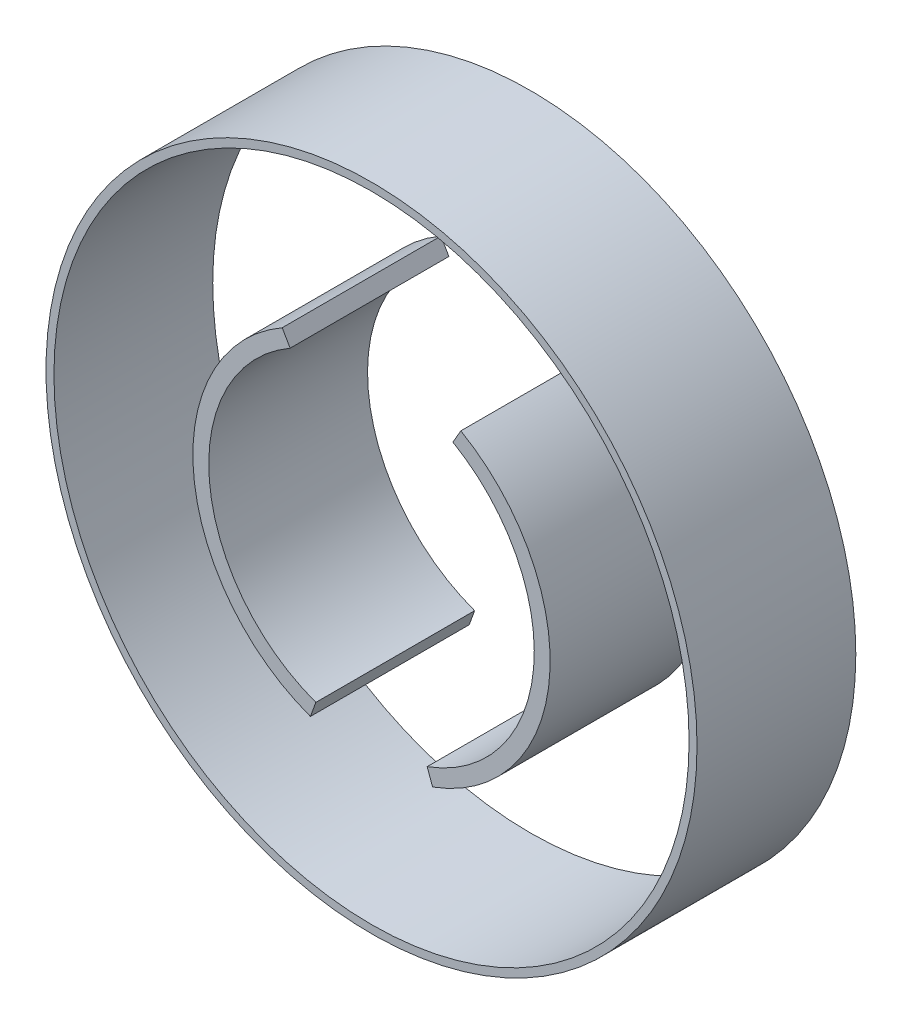
ISO-10303-21;
HEADER;
FILE_DESCRIPTION(('STEP AP214'),'2;1');
FILE_NAME('part.step','',(''),(''),'','','');
FILE_SCHEMA(('AUTOMOTIVE_DESIGN { 1 0 10303 214 1 1 1 1 }'));
ENDSEC;
DATA;
#1=APPLICATION_CONTEXT('core data for automotive mechanical design processes');
#2=APPLICATION_PROTOCOL_DEFINITION('international standard','automotive_design',2000,#1);
#3=PRODUCT_CONTEXT('',#1,'mechanical');
#4=PRODUCT('Part','Part','',(#3));
#5=PRODUCT_RELATED_PRODUCT_CATEGORY('part','',(#4));
#6=PRODUCT_DEFINITION_FORMATION('','',#4);
#7=PRODUCT_DEFINITION_CONTEXT('part definition',#1,'design');
#8=PRODUCT_DEFINITION('design','',#6,#7);
#9=PRODUCT_DEFINITION_SHAPE('','',#8);
#10=(LENGTH_UNIT() NAMED_UNIT(*) SI_UNIT(.MILLI.,.METRE.));
#11=(NAMED_UNIT(*) PLANE_ANGLE_UNIT() SI_UNIT($,.RADIAN.));
#12=(NAMED_UNIT(*) SI_UNIT($,.STERADIAN.) SOLID_ANGLE_UNIT());
#13=UNCERTAINTY_MEASURE_WITH_UNIT(LENGTH_MEASURE(1.E-05),#10,'distance_accuracy_value','');
#14=(GEOMETRIC_REPRESENTATION_CONTEXT(3) GLOBAL_UNCERTAINTY_ASSIGNED_CONTEXT((#13)) GLOBAL_UNIT_ASSIGNED_CONTEXT((#10,
#11,#12)) REPRESENTATION_CONTEXT('',''));
#15=CARTESIAN_POINT('',(0.,0.,0.));
#16=DIRECTION('',(0.,0.,1.));
#17=DIRECTION('',(1.,0.,0.));
#18=AXIS2_PLACEMENT_3D('',#15,#16,#17);
#19=CARTESIAN_POINT('',(0.,0.,2000.));
#20=DIRECTION('',(0.,0.,-1.));
#21=DIRECTION('',(-1.,0.,0.));
#22=AXIS2_PLACEMENT_3D('',#19,#20,#21);
#23=CYLINDRICAL_SURFACE('',#22,2250.);
#24=CARTESIAN_POINT('',(0.,0.,0.));
#25=DIRECTION('',(0.,0.,1.));
#26=DIRECTION('',(1.,0.,0.));
#27=AXIS2_PLACEMENT_3D('',#24,#25,#26);
#28=CIRCLE('',#27,2250.);
#29=CARTESIAN_POINT('',(769.545322482756,-2114.30839676829,0.));
#30=VERTEX_POINT('',#29);
#31=CARTESIAN_POINT('',(1125.,1948.55715851499,0.));
#32=VERTEX_POINT('',#31);
#33=EDGE_CURVE('E120',#30,#32,#28,.T.);
#34=ORIENTED_EDGE('',*,*,#33,.T.);
#35=DIRECTION('',(0.,0.,-1.));
#36=VECTOR('',#35,1.);
#37=CARTESIAN_POINT('',(1125.,1948.55715851499,2000.));
#38=LINE('',#37,#36);
#39=CARTESIAN_POINT('',(1125.,1948.55715851499,2000.));
#40=VERTEX_POINT('',#39);
#41=EDGE_CURVE('E12',#40,#32,#38,.T.);
#42=ORIENTED_EDGE('',*,*,#41,.F.);
#43=CARTESIAN_POINT('',(0.,0.,2000.));
#44=DIRECTION('',(0.,0.,1.));
#45=DIRECTION('',(1.,0.,0.));
#46=AXIS2_PLACEMENT_3D('',#43,#44,#45);
#47=CIRCLE('',#46,2250.);
#48=CARTESIAN_POINT('',(769.545322482756,-2114.30839676829,2000.));
#49=VERTEX_POINT('',#48);
#50=EDGE_CURVE('E104',#49,#40,#47,.T.);
#51=ORIENTED_EDGE('',*,*,#50,.F.);
#52=DIRECTION('',(0.,0.,-1.));
#53=VECTOR('',#52,1.);
#54=CARTESIAN_POINT('',(769.545322482756,-2114.30839676829,2000.));
#55=LINE('',#54,#53);
#56=EDGE_CURVE('E116',#49,#30,#55,.T.);
#57=ORIENTED_EDGE('',*,*,#56,.T.);
#58=EDGE_LOOP('',(#34,#42,#51,#57));
#59=FACE_BOUND('',#58,.T.);
#60=ADVANCED_FACE('F52',(#59),#23,.T.);
#61=CARTESIAN_POINT('',(1125.,1948.55715851499,2000.));
#62=DIRECTION('',(0.866025403784438,-0.500000000000002,0.));
#63=DIRECTION('',(0.500000000000002,0.866025403784438,0.));
#64=AXIS2_PLACEMENT_3D('',#61,#62,#63);
#65=PLANE('',#64);
#66=DIRECTION('',(-0.500000000000002,-0.866025403784438,0.));
#67=VECTOR('',#66,1.);
#68=CARTESIAN_POINT('',(1125.,1948.55715851499,0.));
#69=LINE('',#68,#67);
#70=CARTESIAN_POINT('',(1025.,1775.3520777581,0.));
#71=VERTEX_POINT('',#70);
#72=EDGE_CURVE('E109',#32,#71,#69,.T.);
#73=ORIENTED_EDGE('',*,*,#72,.T.);
#74=DIRECTION('',(0.,0.,-1.));
#75=VECTOR('',#74,1.);
#76=CARTESIAN_POINT('',(1025.,1775.3520777581,2000.));
#77=LINE('',#76,#75);
#78=CARTESIAN_POINT('',(1025.,1775.3520777581,2000.));
#79=VERTEX_POINT('',#78);
#80=EDGE_CURVE('E61',#79,#71,#77,.T.);
#81=ORIENTED_EDGE('',*,*,#80,.F.);
#82=DIRECTION('',(-0.500000000000002,-0.866025403784438,0.));
#83=VECTOR('',#82,1.);
#84=CARTESIAN_POINT('',(1125.,1948.55715851499,2000.));
#85=LINE('',#84,#83);
#86=EDGE_CURVE('E99',#40,#79,#85,.T.);
#87=ORIENTED_EDGE('',*,*,#86,.F.);
#88=ORIENTED_EDGE('',*,*,#41,.T.);
#89=EDGE_LOOP('',(#73,#81,#87,#88));
#90=FACE_BOUND('',#89,.T.);
#91=ADVANCED_FACE('F108',(#90),#65,.F.);
#92=CARTESIAN_POINT('',(0.,0.,2000.));
#93=DIRECTION('',(0.,0.,-1.));
#94=DIRECTION('',(-1.,0.,0.));
#95=AXIS2_PLACEMENT_3D('',#92,#93,#94);
#96=CYLINDRICAL_SURFACE('',#95,2050.);
#97=CARTESIAN_POINT('',(0.,0.,0.));
#98=DIRECTION('',(0.,0.,-1.));
#99=DIRECTION('',(1.,0.,0.));
#100=AXIS2_PLACEMENT_3D('',#97,#98,#99);
#101=CIRCLE('',#100,2050.);
#102=CARTESIAN_POINT('',(701.141293817622,-1926.36987261111,0.));
#103=VERTEX_POINT('',#102);
#104=EDGE_CURVE('E86',#71,#103,#101,.T.);
#105=ORIENTED_EDGE('',*,*,#104,.T.);
#106=DIRECTION('',(0.,0.,-1.));
#107=VECTOR('',#106,1.);
#108=CARTESIAN_POINT('',(701.141293817622,-1926.36987261111,2000.));
#109=LINE('',#108,#107);
#110=CARTESIAN_POINT('',(701.141293817622,-1926.36987261111,2000.));
#111=VERTEX_POINT('',#110);
#112=EDGE_CURVE('E111',#111,#103,#109,.T.);
#113=ORIENTED_EDGE('',*,*,#112,.F.);
#114=CARTESIAN_POINT('',(0.,0.,2000.));
#115=DIRECTION('',(0.,0.,-1.));
#116=DIRECTION('',(1.,0.,0.));
#117=AXIS2_PLACEMENT_3D('',#114,#115,#116);
#118=CIRCLE('',#117,2050.);
#119=EDGE_CURVE('E102',#79,#111,#118,.T.);
#120=ORIENTED_EDGE('',*,*,#119,.F.);
#121=ORIENTED_EDGE('',*,*,#80,.T.);
#122=EDGE_LOOP('',(#105,#113,#120,#121));
#123=FACE_BOUND('',#122,.T.);
#124=ADVANCED_FACE('F112',(#123),#96,.F.);
#125=CARTESIAN_POINT('',(769.545322482756,-2114.30839676829,2000.));
#126=DIRECTION('',(0.939692620785908,0.34202014332567,0.));
#127=DIRECTION('',(-0.34202014332567,0.939692620785908,0.));
#128=AXIS2_PLACEMENT_3D('',#125,#126,#127);
#129=PLANE('',#128);
#130=DIRECTION('',(0.34202014332567,-0.939692620785908,0.));
#131=VECTOR('',#130,1.);
#132=CARTESIAN_POINT('',(769.545322482756,-2114.30839676829,0.));
#133=LINE('',#132,#131);
#134=EDGE_CURVE('E92',#103,#30,#133,.T.);
#135=ORIENTED_EDGE('',*,*,#134,.T.);
#136=ORIENTED_EDGE('',*,*,#56,.F.);
#137=DIRECTION('',(0.34202014332567,-0.939692620785908,0.));
#138=VECTOR('',#137,1.);
#139=CARTESIAN_POINT('',(769.545322482756,-2114.30839676829,2000.));
#140=LINE('',#139,#138);
#141=EDGE_CURVE('E69',#111,#49,#140,.T.);
#142=ORIENTED_EDGE('',*,*,#141,.F.);
#143=ORIENTED_EDGE('',*,*,#112,.T.);
#144=EDGE_LOOP('',(#135,#136,#142,#143));
#145=FACE_BOUND('',#144,.T.);
#146=ADVANCED_FACE('F133',(#145),#129,.F.);
#147=CARTESIAN_POINT('',(0.,0.,2000.));
#148=DIRECTION('',(0.,0.,1.));
#149=DIRECTION('',(1.,0.,0.));
#150=AXIS2_PLACEMENT_3D('',#147,#148,#149);
#151=PLANE('',#150);
#152=ORIENTED_EDGE('',*,*,#50,.T.);
#153=ORIENTED_EDGE('',*,*,#86,.T.);
#154=ORIENTED_EDGE('',*,*,#119,.T.);
#155=ORIENTED_EDGE('',*,*,#141,.T.);
#156=EDGE_LOOP('',(#152,#153,#154,#155));
#157=FACE_BOUND('',#156,.T.);
#158=ADVANCED_FACE('F100',(#157),#151,.T.);
#159=CARTESIAN_POINT('',(0.,0.,0.));
#160=DIRECTION('',(0.,0.,1.));
#161=DIRECTION('',(1.,0.,0.));
#162=AXIS2_PLACEMENT_3D('',#159,#160,#161);
#163=PLANE('',#162);
#164=ORIENTED_EDGE('',*,*,#33,.F.);
#165=ORIENTED_EDGE('',*,*,#134,.F.);
#166=ORIENTED_EDGE('',*,*,#104,.F.);
#167=ORIENTED_EDGE('',*,*,#72,.F.);
#168=EDGE_LOOP('',(#164,#165,#166,#167));
#169=FACE_BOUND('',#168,.T.);
#170=ADVANCED_FACE('F136',(#169),#163,.F.);
#171=CLOSED_SHELL('',(#60,#91,#124,#146,#158,#170));
#172=MANIFOLD_SOLID_BREP('B2',#171);
#173=CARTESIAN_POINT('',(0.,0.,2000.));
#174=DIRECTION('',(0.,0.,-1.));
#175=DIRECTION('',(-1.,0.,0.));
#176=AXIS2_PLACEMENT_3D('',#173,#174,#175);
#177=CYLINDRICAL_SURFACE('',#176,2250.);
#178=CARTESIAN_POINT('',(0.,0.,0.));
#179=DIRECTION('',(0.,0.,1.));
#180=DIRECTION('',(1.,0.,0.));
#181=AXIS2_PLACEMENT_3D('',#178,#179,#180);
#182=CIRCLE('',#181,2250.);
#183=CARTESIAN_POINT('',(-1125.,1948.55715851499,0.));
#184=VERTEX_POINT('',#183);
#185=CARTESIAN_POINT('',(-769.545322482756,-2114.30839676829,0.));
#186=VERTEX_POINT('',#185);
#187=EDGE_CURVE('E270',#184,#186,#182,.T.);
#188=ORIENTED_EDGE('',*,*,#187,.T.);
#189=DIRECTION('',(0.,0.,-1.));
#190=VECTOR('',#189,1.);
#191=CARTESIAN_POINT('',(-769.545322482756,-2114.30839676829,2000.));
#192=LINE('',#191,#190);
#193=CARTESIAN_POINT('',(-769.545322482756,-2114.30839676829,2000.));
#194=VERTEX_POINT('',#193);
#195=EDGE_CURVE('E50',#194,#186,#192,.T.);
#196=ORIENTED_EDGE('',*,*,#195,.F.);
#197=CARTESIAN_POINT('',(0.,0.,2000.));
#198=DIRECTION('',(0.,0.,1.));
#199=DIRECTION('',(1.,0.,0.));
#200=AXIS2_PLACEMENT_3D('',#197,#198,#199);
#201=CIRCLE('',#200,2250.);
#202=CARTESIAN_POINT('',(-1125.,1948.55715851499,2000.));
#203=VERTEX_POINT('',#202);
#204=EDGE_CURVE('E253',#203,#194,#201,.T.);
#205=ORIENTED_EDGE('',*,*,#204,.F.);
#206=DIRECTION('',(0.,0.,-1.));
#207=VECTOR('',#206,1.);
#208=CARTESIAN_POINT('',(-1125.,1948.55715851499,2000.));
#209=LINE('',#208,#207);
#210=EDGE_CURVE('E266',#203,#184,#209,.T.);
#211=ORIENTED_EDGE('',*,*,#210,.T.);
#212=EDGE_LOOP('',(#188,#196,#205,#211));
#213=FACE_BOUND('',#212,.T.);
#214=ADVANCED_FACE('F201',(#213),#177,.T.);
#215=CARTESIAN_POINT('',(-769.545322482756,-2114.30839676829,2000.));
#216=DIRECTION('',(-0.939692620785908,0.342020143325669,0.));
#217=DIRECTION('',(-0.342020143325669,-0.939692620785908,0.));
#218=AXIS2_PLACEMENT_3D('',#215,#216,#217);
#219=PLANE('',#218);
#220=DIRECTION('',(0.342020143325669,0.939692620785908,0.));
#221=VECTOR('',#220,1.);
#222=CARTESIAN_POINT('',(-769.545322482756,-2114.30839676829,0.));
#223=LINE('',#222,#221);
#224=CARTESIAN_POINT('',(-701.141293817622,-1926.36987261111,0.));
#225=VERTEX_POINT('',#224);
#226=EDGE_CURVE('E258',#186,#225,#223,.T.);
#227=ORIENTED_EDGE('',*,*,#226,.T.);
#228=DIRECTION('',(0.,0.,-1.));
#229=VECTOR('',#228,1.);
#230=CARTESIAN_POINT('',(-701.141293817622,-1926.36987261111,2000.));
#231=LINE('',#230,#229);
#232=CARTESIAN_POINT('',(-701.141293817622,-1926.36987261111,2000.));
#233=VERTEX_POINT('',#232);
#234=EDGE_CURVE('E210',#233,#225,#231,.T.);
#235=ORIENTED_EDGE('',*,*,#234,.F.);
#236=DIRECTION('',(0.342020143325669,0.939692620785908,0.));
#237=VECTOR('',#236,1.);
#238=CARTESIAN_POINT('',(-769.545322482756,-2114.30839676829,2000.));
#239=LINE('',#238,#237);
#240=EDGE_CURVE('E248',#194,#233,#239,.T.);
#241=ORIENTED_EDGE('',*,*,#240,.F.);
#242=ORIENTED_EDGE('',*,*,#195,.T.);
#243=EDGE_LOOP('',(#227,#235,#241,#242));
#244=FACE_BOUND('',#243,.T.);
#245=ADVANCED_FACE('F257',(#244),#219,.F.);
#246=CARTESIAN_POINT('',(0.,0.,2000.));
#247=DIRECTION('',(0.,0.,-1.));
#248=DIRECTION('',(-1.,0.,0.));
#249=AXIS2_PLACEMENT_3D('',#246,#247,#248);
#250=CYLINDRICAL_SURFACE('',#249,2050.);
#251=CARTESIAN_POINT('',(0.,0.,0.));
#252=DIRECTION('',(0.,0.,-1.));
#253=DIRECTION('',(1.,0.,0.));
#254=AXIS2_PLACEMENT_3D('',#251,#252,#253);
#255=CIRCLE('',#254,2050.);
#256=CARTESIAN_POINT('',(-1025.,1775.3520777581,0.));
#257=VERTEX_POINT('',#256);
#258=EDGE_CURVE('E235',#225,#257,#255,.T.);
#259=ORIENTED_EDGE('',*,*,#258,.T.);
#260=DIRECTION('',(0.,0.,-1.));
#261=VECTOR('',#260,1.);
#262=CARTESIAN_POINT('',(-1025.,1775.3520777581,2000.));
#263=LINE('',#262,#261);
#264=CARTESIAN_POINT('',(-1025.,1775.3520777581,2000.));
#265=VERTEX_POINT('',#264);
#266=EDGE_CURVE('E260',#265,#257,#263,.T.);
#267=ORIENTED_EDGE('',*,*,#266,.F.);
#268=CARTESIAN_POINT('',(0.,0.,2000.));
#269=DIRECTION('',(0.,0.,-1.));
#270=DIRECTION('',(1.,0.,0.));
#271=AXIS2_PLACEMENT_3D('',#268,#269,#270);
#272=CIRCLE('',#271,2050.);
#273=EDGE_CURVE('E251',#233,#265,#272,.T.);
#274=ORIENTED_EDGE('',*,*,#273,.F.);
#275=ORIENTED_EDGE('',*,*,#234,.T.);
#276=EDGE_LOOP('',(#259,#267,#274,#275));
#277=FACE_BOUND('',#276,.T.);
#278=ADVANCED_FACE('F261',(#277),#250,.F.);
#279=CARTESIAN_POINT('',(-1125.,1948.55715851499,2000.));
#280=DIRECTION('',(-0.866025403784438,-0.500000000000001,0.));
#281=DIRECTION('',(0.500000000000001,-0.866025403784438,0.));
#282=AXIS2_PLACEMENT_3D('',#279,#280,#281);
#283=PLANE('',#282);
#284=DIRECTION('',(-0.500000000000001,0.866025403784438,0.));
#285=VECTOR('',#284,1.);
#286=CARTESIAN_POINT('',(-1125.,1948.55715851499,0.));
#287=LINE('',#286,#285);
#288=EDGE_CURVE('E241',#257,#184,#287,.T.);
#289=ORIENTED_EDGE('',*,*,#288,.T.);
#290=ORIENTED_EDGE('',*,*,#210,.F.);
#291=DIRECTION('',(-0.500000000000001,0.866025403784438,0.));
#292=VECTOR('',#291,1.);
#293=CARTESIAN_POINT('',(-1125.,1948.55715851499,2000.));
#294=LINE('',#293,#292);
#295=EDGE_CURVE('E218',#265,#203,#294,.T.);
#296=ORIENTED_EDGE('',*,*,#295,.F.);
#297=ORIENTED_EDGE('',*,*,#266,.T.);
#298=EDGE_LOOP('',(#289,#290,#296,#297));
#299=FACE_BOUND('',#298,.T.);
#300=ADVANCED_FACE('F282',(#299),#283,.F.);
#301=CARTESIAN_POINT('',(0.,0.,2000.));
#302=DIRECTION('',(0.,0.,1.));
#303=DIRECTION('',(1.,0.,0.));
#304=AXIS2_PLACEMENT_3D('',#301,#302,#303);
#305=PLANE('',#304);
#306=ORIENTED_EDGE('',*,*,#204,.T.);
#307=ORIENTED_EDGE('',*,*,#240,.T.);
#308=ORIENTED_EDGE('',*,*,#273,.T.);
#309=ORIENTED_EDGE('',*,*,#295,.T.);
#310=EDGE_LOOP('',(#306,#307,#308,#309));
#311=FACE_BOUND('',#310,.T.);
#312=ADVANCED_FACE('F249',(#311),#305,.T.);
#313=CARTESIAN_POINT('',(0.,0.,0.));
#314=DIRECTION('',(0.,0.,1.));
#315=DIRECTION('',(1.,0.,0.));
#316=AXIS2_PLACEMENT_3D('',#313,#314,#315);
#317=PLANE('',#316);
#318=ORIENTED_EDGE('',*,*,#187,.F.);
#319=ORIENTED_EDGE('',*,*,#288,.F.);
#320=ORIENTED_EDGE('',*,*,#258,.F.);
#321=ORIENTED_EDGE('',*,*,#226,.F.);
#322=EDGE_LOOP('',(#318,#319,#320,#321));
#323=FACE_BOUND('',#322,.T.);
#324=ADVANCED_FACE('F285',(#323),#317,.F.);
#325=CLOSED_SHELL('',(#214,#245,#278,#300,#312,#324));
#326=MANIFOLD_SOLID_BREP('B6',#325);
#327=CARTESIAN_POINT('',(0.,0.,2000.));
#328=DIRECTION('',(0.,0.,1.));
#329=DIRECTION('',(1.,0.,0.));
#330=AXIS2_PLACEMENT_3D('',#327,#328,#329);
#331=PLANE('',#330);
#332=CARTESIAN_POINT('',(0.,0.,2000.));
#333=DIRECTION('',(0.,0.,1.));
#334=DIRECTION('',(1.,0.,0.));
#335=AXIS2_PLACEMENT_3D('',#332,#333,#334);
#336=CIRCLE('',#335,4100.);
#337=CARTESIAN_POINT('',(4100.,0.,2000.));
#338=VERTEX_POINT('',#337);
#339=EDGE_CURVE('E200',#338,#338,#336,.T.);
#340=ORIENTED_EDGE('',*,*,#339,.T.);
#341=EDGE_LOOP('',(#340));
#342=FACE_BOUND('',#341,.T.);
#343=CARTESIAN_POINT('',(0.,0.,2000.));
#344=DIRECTION('',(0.,0.,1.));
#345=DIRECTION('',(1.,0.,0.));
#346=AXIS2_PLACEMENT_3D('',#343,#344,#345);
#347=CIRCLE('',#346,4000.);
#348=CARTESIAN_POINT('',(4000.,0.,2000.));
#349=VERTEX_POINT('',#348);
#350=EDGE_CURVE('E357',#349,#349,#347,.T.);
#351=ORIENTED_EDGE('',*,*,#350,.F.);
#352=EDGE_LOOP('',(#351));
#353=FACE_BOUND('',#352,.T.);
#354=ADVANCED_FACE('F343',(#342,#353),#331,.T.);
#355=CARTESIAN_POINT('',(0.,0.,0.));
#356=DIRECTION('',(0.,0.,1.));
#357=DIRECTION('',(1.,0.,0.));
#358=AXIS2_PLACEMENT_3D('',#355,#356,#357);
#359=PLANE('',#358);
#360=CARTESIAN_POINT('',(0.,0.,0.));
#361=DIRECTION('',(0.,0.,1.));
#362=DIRECTION('',(1.,0.,0.));
#363=AXIS2_PLACEMENT_3D('',#360,#361,#362);
#364=CIRCLE('',#363,4100.);
#365=CARTESIAN_POINT('',(4100.,0.,0.));
#366=VERTEX_POINT('',#365);
#367=EDGE_CURVE('E347',#366,#366,#364,.T.);
#368=ORIENTED_EDGE('',*,*,#367,.F.);
#369=EDGE_LOOP('',(#368));
#370=FACE_BOUND('',#369,.T.);
#371=CARTESIAN_POINT('',(0.,0.,0.));
#372=DIRECTION('',(0.,0.,1.));
#373=DIRECTION('',(1.,0.,0.));
#374=AXIS2_PLACEMENT_3D('',#371,#372,#373);
#375=CIRCLE('',#374,4000.);
#376=CARTESIAN_POINT('',(4000.,0.,0.));
#377=VERTEX_POINT('',#376);
#378=EDGE_CURVE('E359',#377,#377,#375,.T.);
#379=ORIENTED_EDGE('',*,*,#378,.T.);
#380=EDGE_LOOP('',(#379));
#381=FACE_BOUND('',#380,.T.);
#382=ADVANCED_FACE('F370',(#370,#381),#359,.F.);
#383=CARTESIAN_POINT('',(0.,0.,2000.));
#384=DIRECTION('',(0.,0.,-1.));
#385=DIRECTION('',(-1.,0.,0.));
#386=AXIS2_PLACEMENT_3D('',#383,#384,#385);
#387=CYLINDRICAL_SURFACE('',#386,4100.);
#388=ORIENTED_EDGE('',*,*,#339,.F.);
#389=EDGE_LOOP('',(#388));
#390=FACE_BOUND('',#389,.T.);
#391=ORIENTED_EDGE('',*,*,#367,.T.);
#392=EDGE_LOOP('',(#391));
#393=FACE_BOUND('',#392,.T.);
#394=ADVANCED_FACE('F345',(#390,#393),#387,.T.);
#395=CARTESIAN_POINT('',(0.,0.,2000.));
#396=DIRECTION('',(0.,0.,-1.));
#397=DIRECTION('',(-1.,0.,0.));
#398=AXIS2_PLACEMENT_3D('',#395,#396,#397);
#399=CYLINDRICAL_SURFACE('',#398,4000.);
#400=ORIENTED_EDGE('',*,*,#350,.T.);
#401=EDGE_LOOP('',(#400));
#402=FACE_BOUND('',#401,.T.);
#403=ORIENTED_EDGE('',*,*,#378,.F.);
#404=EDGE_LOOP('',(#403));
#405=FACE_BOUND('',#404,.T.);
#406=ADVANCED_FACE('F366',(#402,#405),#399,.F.);
#407=CLOSED_SHELL('',(#354,#382,#394,#406));
#408=MANIFOLD_SOLID_BREP('B44',#407);
#409=ADVANCED_BREP_SHAPE_REPRESENTATION('',(#18,#172,#326,#408),#14);
#410=SHAPE_DEFINITION_REPRESENTATION(#9,#409);
ENDSEC;
END-ISO-10303-21;
